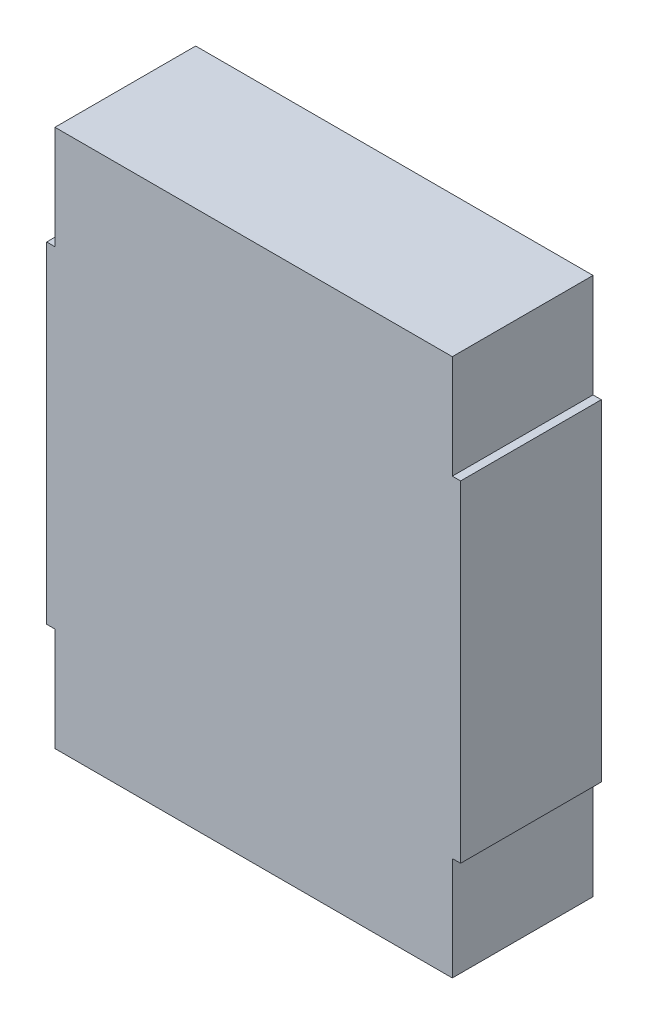
ISO-10303-21;
HEADER;
FILE_DESCRIPTION(('STEP AP214'),'2;1');
FILE_NAME('part.step','',(''),(''),'','','');
FILE_SCHEMA(('AUTOMOTIVE_DESIGN { 1 0 10303 214 1 1 1 1 }'));
ENDSEC;
DATA;
#1=APPLICATION_CONTEXT('core data for automotive mechanical design processes');
#2=APPLICATION_PROTOCOL_DEFINITION('international standard','automotive_design',2000,#1);
#3=PRODUCT_CONTEXT('',#1,'mechanical');
#4=PRODUCT('Part','Part','',(#3));
#5=PRODUCT_RELATED_PRODUCT_CATEGORY('part','',(#4));
#6=PRODUCT_DEFINITION_FORMATION('','',#4);
#7=PRODUCT_DEFINITION_CONTEXT('part definition',#1,'design');
#8=PRODUCT_DEFINITION('design','',#6,#7);
#9=PRODUCT_DEFINITION_SHAPE('','',#8);
#10=(LENGTH_UNIT() NAMED_UNIT(*) SI_UNIT(.MILLI.,.METRE.));
#11=(NAMED_UNIT(*) PLANE_ANGLE_UNIT() SI_UNIT($,.RADIAN.));
#12=(NAMED_UNIT(*) SI_UNIT($,.STERADIAN.) SOLID_ANGLE_UNIT());
#13=UNCERTAINTY_MEASURE_WITH_UNIT(LENGTH_MEASURE(1.E-05),#10,'distance_accuracy_value','');
#14=(GEOMETRIC_REPRESENTATION_CONTEXT(3) GLOBAL_UNCERTAINTY_ASSIGNED_CONTEXT((#13)) GLOBAL_UNIT_ASSIGNED_CONTEXT((#10,
#11,#12)) REPRESENTATION_CONTEXT('',''));
#15=CARTESIAN_POINT('',(0.,0.,0.));
#16=DIRECTION('',(0.,0.,1.));
#17=DIRECTION('',(1.,0.,0.));
#18=AXIS2_PLACEMENT_3D('',#15,#16,#17);
#19=CARTESIAN_POINT('',(2.4,-3.25,1.7));
#20=DIRECTION('',(0.,1.,0.));
#21=DIRECTION('',(0.,0.,1.));
#22=AXIS2_PLACEMENT_3D('',#19,#20,#21);
#23=PLANE('',#22);
#24=DIRECTION('',(1.,0.,0.));
#25=VECTOR('',#24,1.);
#26=CARTESIAN_POINT('',(2.4,-3.25,0.));
#27=LINE('',#26,#25);
#28=CARTESIAN_POINT('',(-2.4,-3.25,0.));
#29=VERTEX_POINT('',#28);
#30=CARTESIAN_POINT('',(2.4,-3.25,0.));
#31=VERTEX_POINT('',#30);
#32=EDGE_CURVE('E154',#29,#31,#27,.T.);
#33=ORIENTED_EDGE('',*,*,#32,.T.);
#34=DIRECTION('',(0.,0.,-1.));
#35=VECTOR('',#34,1.);
#36=CARTESIAN_POINT('',(2.4,-3.25,1.7));
#37=LINE('',#36,#35);
#38=CARTESIAN_POINT('',(2.4,-3.25,1.7));
#39=VERTEX_POINT('',#38);
#40=EDGE_CURVE('E11',#39,#31,#37,.T.);
#41=ORIENTED_EDGE('',*,*,#40,.F.);
#42=DIRECTION('',(1.,0.,0.));
#43=VECTOR('',#42,1.);
#44=CARTESIAN_POINT('',(2.4,-3.25,1.7));
#45=LINE('',#44,#43);
#46=CARTESIAN_POINT('',(-2.4,-3.25,1.7));
#47=VERTEX_POINT('',#46);
#48=EDGE_CURVE('E176',#47,#39,#45,.T.);
#49=ORIENTED_EDGE('',*,*,#48,.F.);
#50=DIRECTION('',(0.,0.,-1.));
#51=VECTOR('',#50,1.);
#52=CARTESIAN_POINT('',(-2.4,-3.25,1.7));
#53=LINE('',#52,#51);
#54=EDGE_CURVE('E150',#47,#29,#53,.T.);
#55=ORIENTED_EDGE('',*,*,#54,.T.);
#56=EDGE_LOOP('',(#33,#41,#49,#55));
#57=FACE_BOUND('',#56,.T.);
#58=ADVANCED_FACE('F34',(#57),#23,.F.);
#59=CARTESIAN_POINT('',(2.4,-2.,1.7));
#60=DIRECTION('',(-1.,0.,0.));
#61=DIRECTION('',(0.,0.,1.));
#62=AXIS2_PLACEMENT_3D('',#59,#60,#61);
#63=PLANE('',#62);
#64=DIRECTION('',(0.,1.,0.));
#65=VECTOR('',#64,1.);
#66=CARTESIAN_POINT('',(2.4,-2.,0.));
#67=LINE('',#66,#65);
#68=CARTESIAN_POINT('',(2.4,-2.,0.));
#69=VERTEX_POINT('',#68);
#70=EDGE_CURVE('E157',#31,#69,#67,.T.);
#71=ORIENTED_EDGE('',*,*,#70,.T.);
#72=DIRECTION('',(0.,0.,-1.));
#73=VECTOR('',#72,1.);
#74=CARTESIAN_POINT('',(2.4,-2.,1.7));
#75=LINE('',#74,#73);
#76=CARTESIAN_POINT('',(2.4,-2.,1.7));
#77=VERTEX_POINT('',#76);
#78=EDGE_CURVE('E42',#77,#69,#75,.T.);
#79=ORIENTED_EDGE('',*,*,#78,.F.);
#80=DIRECTION('',(0.,1.,0.));
#81=VECTOR('',#80,1.);
#82=CARTESIAN_POINT('',(2.4,-2.,1.7));
#83=LINE('',#82,#81);
#84=EDGE_CURVE('E105',#39,#77,#83,.T.);
#85=ORIENTED_EDGE('',*,*,#84,.F.);
#86=ORIENTED_EDGE('',*,*,#40,.T.);
#87=EDGE_LOOP('',(#71,#79,#85,#86));
#88=FACE_BOUND('',#87,.T.);
#89=ADVANCED_FACE('F254',(#88),#63,.F.);
#90=CARTESIAN_POINT('',(2.5,-2.,1.7));
#91=DIRECTION('',(0.,1.,0.));
#92=DIRECTION('',(0.,0.,1.));
#93=AXIS2_PLACEMENT_3D('',#90,#91,#92);
#94=PLANE('',#93);
#95=DIRECTION('',(1.,0.,0.));
#96=VECTOR('',#95,1.);
#97=CARTESIAN_POINT('',(2.5,-2.,0.));
#98=LINE('',#97,#96);
#99=CARTESIAN_POINT('',(2.5,-2.,0.));
#100=VERTEX_POINT('',#99);
#101=EDGE_CURVE('E159',#69,#100,#98,.T.);
#102=ORIENTED_EDGE('',*,*,#101,.T.);
#103=DIRECTION('',(0.,0.,-1.));
#104=VECTOR('',#103,1.);
#105=CARTESIAN_POINT('',(2.5,-2.,1.7));
#106=LINE('',#105,#104);
#107=CARTESIAN_POINT('',(2.5,-2.,1.7));
#108=VERTEX_POINT('',#107);
#109=EDGE_CURVE('E195',#108,#100,#106,.T.);
#110=ORIENTED_EDGE('',*,*,#109,.F.);
#111=DIRECTION('',(1.,0.,0.));
#112=VECTOR('',#111,1.);
#113=CARTESIAN_POINT('',(2.5,-2.,1.7));
#114=LINE('',#113,#112);
#115=EDGE_CURVE('E203',#77,#108,#114,.T.);
#116=ORIENTED_EDGE('',*,*,#115,.F.);
#117=ORIENTED_EDGE('',*,*,#78,.T.);
#118=EDGE_LOOP('',(#102,#110,#116,#117));
#119=FACE_BOUND('',#118,.T.);
#120=ADVANCED_FACE('F201',(#119),#94,.F.);
#121=CARTESIAN_POINT('',(2.5,2.,1.7));
#122=DIRECTION('',(-1.,0.,0.));
#123=DIRECTION('',(0.,0.,1.));
#124=AXIS2_PLACEMENT_3D('',#121,#122,#123);
#125=PLANE('',#124);
#126=DIRECTION('',(0.,1.,0.));
#127=VECTOR('',#126,1.);
#128=CARTESIAN_POINT('',(2.5,2.,0.));
#129=LINE('',#128,#127);
#130=CARTESIAN_POINT('',(2.5,2.,0.));
#131=VERTEX_POINT('',#130);
#132=EDGE_CURVE('E161',#100,#131,#129,.T.);
#133=ORIENTED_EDGE('',*,*,#132,.T.);
#134=DIRECTION('',(0.,0.,-1.));
#135=VECTOR('',#134,1.);
#136=CARTESIAN_POINT('',(2.5,2.,1.7));
#137=LINE('',#136,#135);
#138=CARTESIAN_POINT('',(2.5,2.,1.7));
#139=VERTEX_POINT('',#138);
#140=EDGE_CURVE('E192',#139,#131,#137,.T.);
#141=ORIENTED_EDGE('',*,*,#140,.F.);
#142=DIRECTION('',(0.,1.,0.));
#143=VECTOR('',#142,1.);
#144=CARTESIAN_POINT('',(2.5,2.,1.7));
#145=LINE('',#144,#143);
#146=EDGE_CURVE('E221',#108,#139,#145,.T.);
#147=ORIENTED_EDGE('',*,*,#146,.F.);
#148=ORIENTED_EDGE('',*,*,#109,.T.);
#149=EDGE_LOOP('',(#133,#141,#147,#148));
#150=FACE_BOUND('',#149,.T.);
#151=ADVANCED_FACE('F212',(#150),#125,.F.);
#152=CARTESIAN_POINT('',(2.4,2.,1.7));
#153=DIRECTION('',(0.,-1.,0.));
#154=DIRECTION('',(0.,0.,-1.));
#155=AXIS2_PLACEMENT_3D('',#152,#153,#154);
#156=PLANE('',#155);
#157=DIRECTION('',(-1.,0.,0.));
#158=VECTOR('',#157,1.);
#159=CARTESIAN_POINT('',(2.4,2.,0.));
#160=LINE('',#159,#158);
#161=CARTESIAN_POINT('',(2.4,2.,0.));
#162=VERTEX_POINT('',#161);
#163=EDGE_CURVE('E163',#131,#162,#160,.T.);
#164=ORIENTED_EDGE('',*,*,#163,.T.);
#165=DIRECTION('',(0.,0.,-1.));
#166=VECTOR('',#165,1.);
#167=CARTESIAN_POINT('',(2.4,2.,1.7));
#168=LINE('',#167,#166);
#169=CARTESIAN_POINT('',(2.4,2.,1.7));
#170=VERTEX_POINT('',#169);
#171=EDGE_CURVE('E189',#170,#162,#168,.T.);
#172=ORIENTED_EDGE('',*,*,#171,.F.);
#173=DIRECTION('',(-1.,0.,0.));
#174=VECTOR('',#173,1.);
#175=CARTESIAN_POINT('',(2.4,2.,1.7));
#176=LINE('',#175,#174);
#177=EDGE_CURVE('E218',#139,#170,#176,.T.);
#178=ORIENTED_EDGE('',*,*,#177,.F.);
#179=ORIENTED_EDGE('',*,*,#140,.T.);
#180=EDGE_LOOP('',(#164,#172,#178,#179));
#181=FACE_BOUND('',#180,.T.);
#182=ADVANCED_FACE('F216',(#181),#156,.F.);
#183=CARTESIAN_POINT('',(2.4,3.25,1.7));
#184=DIRECTION('',(-1.,0.,0.));
#185=DIRECTION('',(0.,0.,1.));
#186=AXIS2_PLACEMENT_3D('',#183,#184,#185);
#187=PLANE('',#186);
#188=DIRECTION('',(0.,1.,0.));
#189=VECTOR('',#188,1.);
#190=CARTESIAN_POINT('',(2.4,3.25,0.));
#191=LINE('',#190,#189);
#192=CARTESIAN_POINT('',(2.4,3.25,0.));
#193=VERTEX_POINT('',#192);
#194=EDGE_CURVE('E165',#162,#193,#191,.T.);
#195=ORIENTED_EDGE('',*,*,#194,.T.);
#196=DIRECTION('',(0.,0.,-1.));
#197=VECTOR('',#196,1.);
#198=CARTESIAN_POINT('',(2.4,3.25,1.7));
#199=LINE('',#198,#197);
#200=CARTESIAN_POINT('',(2.4,3.25,1.7));
#201=VERTEX_POINT('',#200);
#202=EDGE_CURVE('E186',#201,#193,#199,.T.);
#203=ORIENTED_EDGE('',*,*,#202,.F.);
#204=DIRECTION('',(0.,1.,0.));
#205=VECTOR('',#204,1.);
#206=CARTESIAN_POINT('',(2.4,3.25,1.7));
#207=LINE('',#206,#205);
#208=EDGE_CURVE('E220',#170,#201,#207,.T.);
#209=ORIENTED_EDGE('',*,*,#208,.F.);
#210=ORIENTED_EDGE('',*,*,#171,.T.);
#211=EDGE_LOOP('',(#195,#203,#209,#210));
#212=FACE_BOUND('',#211,.T.);
#213=ADVANCED_FACE('F267',(#212),#187,.F.);
#214=CARTESIAN_POINT('',(-2.4,3.25,1.7));
#215=DIRECTION('',(0.,-1.,0.));
#216=DIRECTION('',(0.,0.,-1.));
#217=AXIS2_PLACEMENT_3D('',#214,#215,#216);
#218=PLANE('',#217);
#219=DIRECTION('',(-1.,0.,0.));
#220=VECTOR('',#219,1.);
#221=CARTESIAN_POINT('',(-2.4,3.25,0.));
#222=LINE('',#221,#220);
#223=CARTESIAN_POINT('',(-2.4,3.25,0.));
#224=VERTEX_POINT('',#223);
#225=EDGE_CURVE('E167',#193,#224,#222,.T.);
#226=ORIENTED_EDGE('',*,*,#225,.T.);
#227=DIRECTION('',(0.,0.,-1.));
#228=VECTOR('',#227,1.);
#229=CARTESIAN_POINT('',(-2.4,3.25,1.7));
#230=LINE('',#229,#228);
#231=CARTESIAN_POINT('',(-2.4,3.25,1.7));
#232=VERTEX_POINT('',#231);
#233=EDGE_CURVE('E183',#232,#224,#230,.T.);
#234=ORIENTED_EDGE('',*,*,#233,.F.);
#235=DIRECTION('',(-1.,0.,0.));
#236=VECTOR('',#235,1.);
#237=CARTESIAN_POINT('',(-2.4,3.25,1.7));
#238=LINE('',#237,#236);
#239=EDGE_CURVE('E223',#201,#232,#238,.T.);
#240=ORIENTED_EDGE('',*,*,#239,.F.);
#241=ORIENTED_EDGE('',*,*,#202,.T.);
#242=EDGE_LOOP('',(#226,#234,#240,#241));
#243=FACE_BOUND('',#242,.T.);
#244=ADVANCED_FACE('F270',(#243),#218,.F.);
#245=CARTESIAN_POINT('',(-2.4,2.,1.7));
#246=DIRECTION('',(1.,0.,0.));
#247=DIRECTION('',(0.,0.,-1.));
#248=AXIS2_PLACEMENT_3D('',#245,#246,#247);
#249=PLANE('',#248);
#250=DIRECTION('',(0.,-1.,0.));
#251=VECTOR('',#250,1.);
#252=CARTESIAN_POINT('',(-2.4,2.,0.));
#253=LINE('',#252,#251);
#254=CARTESIAN_POINT('',(-2.4,2.,0.));
#255=VERTEX_POINT('',#254);
#256=EDGE_CURVE('E169',#224,#255,#253,.T.);
#257=ORIENTED_EDGE('',*,*,#256,.T.);
#258=DIRECTION('',(0.,0.,-1.));
#259=VECTOR('',#258,1.);
#260=CARTESIAN_POINT('',(-2.4,2.,1.7));
#261=LINE('',#260,#259);
#262=CARTESIAN_POINT('',(-2.4,2.,1.7));
#263=VERTEX_POINT('',#262);
#264=EDGE_CURVE('E180',#263,#255,#261,.T.);
#265=ORIENTED_EDGE('',*,*,#264,.F.);
#266=DIRECTION('',(0.,-1.,0.));
#267=VECTOR('',#266,1.);
#268=CARTESIAN_POINT('',(-2.4,2.,1.7));
#269=LINE('',#268,#267);
#270=EDGE_CURVE('E229',#232,#263,#269,.T.);
#271=ORIENTED_EDGE('',*,*,#270,.F.);
#272=ORIENTED_EDGE('',*,*,#233,.T.);
#273=EDGE_LOOP('',(#257,#265,#271,#272));
#274=FACE_BOUND('',#273,.T.);
#275=ADVANCED_FACE('F235',(#274),#249,.F.);
#276=CARTESIAN_POINT('',(-2.5,2.,1.7));
#277=DIRECTION('',(0.,-1.,0.));
#278=DIRECTION('',(0.,0.,-1.));
#279=AXIS2_PLACEMENT_3D('',#276,#277,#278);
#280=PLANE('',#279);
#281=DIRECTION('',(-1.,0.,0.));
#282=VECTOR('',#281,1.);
#283=CARTESIAN_POINT('',(-2.5,2.,0.));
#284=LINE('',#283,#282);
#285=CARTESIAN_POINT('',(-2.5,2.,0.));
#286=VERTEX_POINT('',#285);
#287=EDGE_CURVE('E171',#255,#286,#284,.T.);
#288=ORIENTED_EDGE('',*,*,#287,.T.);
#289=DIRECTION('',(0.,0.,-1.));
#290=VECTOR('',#289,1.);
#291=CARTESIAN_POINT('',(-2.5,2.,1.7));
#292=LINE('',#291,#290);
#293=CARTESIAN_POINT('',(-2.5,2.,1.7));
#294=VERTEX_POINT('',#293);
#295=EDGE_CURVE('E145',#294,#286,#292,.T.);
#296=ORIENTED_EDGE('',*,*,#295,.F.);
#297=DIRECTION('',(-1.,0.,0.));
#298=VECTOR('',#297,1.);
#299=CARTESIAN_POINT('',(-2.5,2.,1.7));
#300=LINE('',#299,#298);
#301=EDGE_CURVE('E136',#263,#294,#300,.T.);
#302=ORIENTED_EDGE('',*,*,#301,.F.);
#303=ORIENTED_EDGE('',*,*,#264,.T.);
#304=EDGE_LOOP('',(#288,#296,#302,#303));
#305=FACE_BOUND('',#304,.T.);
#306=ADVANCED_FACE('F239',(#305),#280,.F.);
#307=CARTESIAN_POINT('',(-2.5,-2.,1.7));
#308=DIRECTION('',(1.,0.,0.));
#309=DIRECTION('',(0.,0.,-1.));
#310=AXIS2_PLACEMENT_3D('',#307,#308,#309);
#311=PLANE('',#310);
#312=DIRECTION('',(0.,-1.,0.));
#313=VECTOR('',#312,1.);
#314=CARTESIAN_POINT('',(-2.5,-2.,0.));
#315=LINE('',#314,#313);
#316=CARTESIAN_POINT('',(-2.5,-2.,0.));
#317=VERTEX_POINT('',#316);
#318=EDGE_CURVE('E144',#286,#317,#315,.T.);
#319=ORIENTED_EDGE('',*,*,#318,.T.);
#320=DIRECTION('',(0.,0.,-1.));
#321=VECTOR('',#320,1.);
#322=CARTESIAN_POINT('',(-2.5,-2.,1.7));
#323=LINE('',#322,#321);
#324=CARTESIAN_POINT('',(-2.5,-2.,1.7));
#325=VERTEX_POINT('',#324);
#326=EDGE_CURVE('E141',#325,#317,#323,.T.);
#327=ORIENTED_EDGE('',*,*,#326,.F.);
#328=DIRECTION('',(0.,-1.,0.));
#329=VECTOR('',#328,1.);
#330=CARTESIAN_POINT('',(-2.5,-2.,1.7));
#331=LINE('',#330,#329);
#332=EDGE_CURVE('E130',#294,#325,#331,.T.);
#333=ORIENTED_EDGE('',*,*,#332,.F.);
#334=ORIENTED_EDGE('',*,*,#295,.T.);
#335=EDGE_LOOP('',(#319,#327,#333,#334));
#336=FACE_BOUND('',#335,.T.);
#337=ADVANCED_FACE('F142',(#336),#311,.F.);
#338=CARTESIAN_POINT('',(-2.4,-2.,1.7));
#339=DIRECTION('',(0.,1.,0.));
#340=DIRECTION('',(0.,0.,1.));
#341=AXIS2_PLACEMENT_3D('',#338,#339,#340);
#342=PLANE('',#341);
#343=DIRECTION('',(1.,0.,0.));
#344=VECTOR('',#343,1.);
#345=CARTESIAN_POINT('',(-2.4,-2.,0.));
#346=LINE('',#345,#344);
#347=CARTESIAN_POINT('',(-2.4,-2.,0.));
#348=VERTEX_POINT('',#347);
#349=EDGE_CURVE('E91',#317,#348,#346,.T.);
#350=ORIENTED_EDGE('',*,*,#349,.T.);
#351=DIRECTION('',(0.,0.,-1.));
#352=VECTOR('',#351,1.);
#353=CARTESIAN_POINT('',(-2.4,-2.,1.7));
#354=LINE('',#353,#352);
#355=CARTESIAN_POINT('',(-2.4,-2.,1.7));
#356=VERTEX_POINT('',#355);
#357=EDGE_CURVE('E146',#356,#348,#354,.T.);
#358=ORIENTED_EDGE('',*,*,#357,.F.);
#359=DIRECTION('',(1.,0.,0.));
#360=VECTOR('',#359,1.);
#361=CARTESIAN_POINT('',(-2.4,-2.,1.7));
#362=LINE('',#361,#360);
#363=EDGE_CURVE('E134',#325,#356,#362,.T.);
#364=ORIENTED_EDGE('',*,*,#363,.F.);
#365=ORIENTED_EDGE('',*,*,#326,.T.);
#366=EDGE_LOOP('',(#350,#358,#364,#365));
#367=FACE_BOUND('',#366,.T.);
#368=ADVANCED_FACE('F148',(#367),#342,.F.);
#369=CARTESIAN_POINT('',(-2.4,-3.25,1.7));
#370=DIRECTION('',(1.,0.,0.));
#371=DIRECTION('',(0.,0.,-1.));
#372=AXIS2_PLACEMENT_3D('',#369,#370,#371);
#373=PLANE('',#372);
#374=DIRECTION('',(0.,-1.,0.));
#375=VECTOR('',#374,1.);
#376=CARTESIAN_POINT('',(-2.4,-3.25,0.));
#377=LINE('',#376,#375);
#378=EDGE_CURVE('E97',#348,#29,#377,.T.);
#379=ORIENTED_EDGE('',*,*,#378,.T.);
#380=ORIENTED_EDGE('',*,*,#54,.F.);
#381=DIRECTION('',(0.,-1.,0.));
#382=VECTOR('',#381,1.);
#383=CARTESIAN_POINT('',(-2.4,-3.25,1.7));
#384=LINE('',#383,#382);
#385=EDGE_CURVE('E50',#356,#47,#384,.T.);
#386=ORIENTED_EDGE('',*,*,#385,.F.);
#387=ORIENTED_EDGE('',*,*,#357,.T.);
#388=EDGE_LOOP('',(#379,#380,#386,#387));
#389=FACE_BOUND('',#388,.T.);
#390=ADVANCED_FACE('F243',(#389),#373,.F.);
#391=CARTESIAN_POINT('',(0.,0.,1.7));
#392=DIRECTION('',(0.,0.,-1.));
#393=DIRECTION('',(-1.,0.,0.));
#394=AXIS2_PLACEMENT_3D('',#391,#392,#393);
#395=PLANE('',#394);
#396=ORIENTED_EDGE('',*,*,#48,.T.);
#397=ORIENTED_EDGE('',*,*,#84,.T.);
#398=ORIENTED_EDGE('',*,*,#115,.T.);
#399=ORIENTED_EDGE('',*,*,#146,.T.);
#400=ORIENTED_EDGE('',*,*,#177,.T.);
#401=ORIENTED_EDGE('',*,*,#208,.T.);
#402=ORIENTED_EDGE('',*,*,#239,.T.);
#403=ORIENTED_EDGE('',*,*,#270,.T.);
#404=ORIENTED_EDGE('',*,*,#301,.T.);
#405=ORIENTED_EDGE('',*,*,#332,.T.);
#406=ORIENTED_EDGE('',*,*,#363,.T.);
#407=ORIENTED_EDGE('',*,*,#385,.T.);
#408=EDGE_LOOP('',(#396,#397,#398,#399,#400,#401,#402,#403,#404,#405,#406,#407));
#409=FACE_BOUND('',#408,.T.);
#410=ADVANCED_FACE('F132',(#409),#395,.F.);
#411=CARTESIAN_POINT('',(0.,0.,0.));
#412=DIRECTION('',(0.,0.,-1.));
#413=DIRECTION('',(-1.,0.,0.));
#414=AXIS2_PLACEMENT_3D('',#411,#412,#413);
#415=PLANE('',#414);
#416=ORIENTED_EDGE('',*,*,#32,.F.);
#417=ORIENTED_EDGE('',*,*,#378,.F.);
#418=ORIENTED_EDGE('',*,*,#349,.F.);
#419=ORIENTED_EDGE('',*,*,#318,.F.);
#420=ORIENTED_EDGE('',*,*,#287,.F.);
#421=ORIENTED_EDGE('',*,*,#256,.F.);
#422=ORIENTED_EDGE('',*,*,#225,.F.);
#423=ORIENTED_EDGE('',*,*,#194,.F.);
#424=ORIENTED_EDGE('',*,*,#163,.F.);
#425=ORIENTED_EDGE('',*,*,#132,.F.);
#426=ORIENTED_EDGE('',*,*,#101,.F.);
#427=ORIENTED_EDGE('',*,*,#70,.F.);
#428=EDGE_LOOP('',(#416,#417,#418,#419,#420,#421,#422,#423,#424,#425,#426,#427));
#429=FACE_BOUND('',#428,.T.);
#430=ADVANCED_FACE('F207',(#429),#415,.T.);
#431=CLOSED_SHELL('',(#58,#89,#120,#151,#182,#213,#244,#275,#306,#337,#368,#390,#410,#430));
#432=MANIFOLD_SOLID_BREP('B2',#431);
#433=ADVANCED_BREP_SHAPE_REPRESENTATION('',(#18,#432),#14);
#434=SHAPE_DEFINITION_REPRESENTATION(#9,#433);
ENDSEC;
END-ISO-10303-21;
